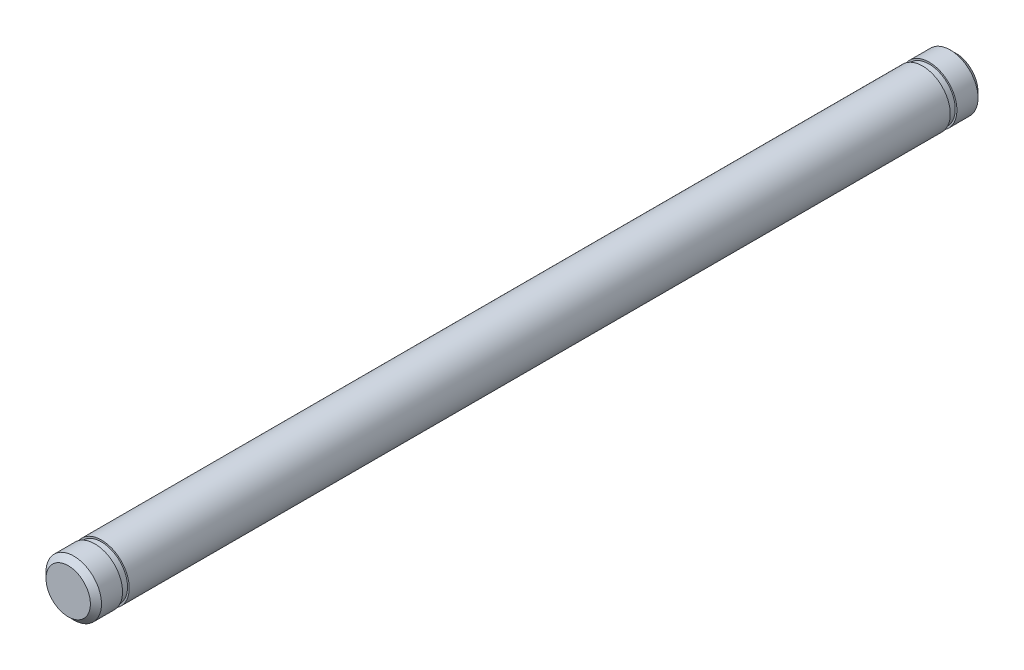
ISO-10303-21;
HEADER;
FILE_DESCRIPTION(('STEP AP214'),'2;1');
FILE_NAME('part.step','',(''),(''),'','','');
FILE_SCHEMA(('AUTOMOTIVE_DESIGN { 1 0 10303 214 1 1 1 1 }'));
ENDSEC;
DATA;
#1=APPLICATION_CONTEXT('core data for automotive mechanical design processes');
#2=APPLICATION_PROTOCOL_DEFINITION('international standard','automotive_design',2000,#1);
#3=PRODUCT_CONTEXT('',#1,'mechanical');
#4=PRODUCT('Part','Part','',(#3));
#5=PRODUCT_RELATED_PRODUCT_CATEGORY('part','',(#4));
#6=PRODUCT_DEFINITION_FORMATION('','',#4);
#7=PRODUCT_DEFINITION_CONTEXT('part definition',#1,'design');
#8=PRODUCT_DEFINITION('design','',#6,#7);
#9=PRODUCT_DEFINITION_SHAPE('','',#8);
#10=(LENGTH_UNIT() NAMED_UNIT(*) SI_UNIT(.MILLI.,.METRE.));
#11=(NAMED_UNIT(*) PLANE_ANGLE_UNIT() SI_UNIT($,.RADIAN.));
#12=(NAMED_UNIT(*) SI_UNIT($,.STERADIAN.) SOLID_ANGLE_UNIT());
#13=UNCERTAINTY_MEASURE_WITH_UNIT(LENGTH_MEASURE(1.E-05),#10,'distance_accuracy_value','');
#14=(GEOMETRIC_REPRESENTATION_CONTEXT(3) GLOBAL_UNCERTAINTY_ASSIGNED_CONTEXT((#13)) GLOBAL_UNIT_ASSIGNED_CONTEXT((#10,
#11,#12)) REPRESENTATION_CONTEXT('',''));
#15=CARTESIAN_POINT('',(0.,0.,0.));
#16=DIRECTION('',(0.,0.,1.));
#17=DIRECTION('',(1.,0.,0.));
#18=AXIS2_PLACEMENT_3D('',#15,#16,#17);
#19=CARTESIAN_POINT('',(0.,0.,80.));
#20=DIRECTION('',(0.,0.,-1.));
#21=DIRECTION('',(-1.,0.,0.));
#22=AXIS2_PLACEMENT_3D('',#19,#20,#21);
#23=CYLINDRICAL_SURFACE('',#22,2.5);
#24=CARTESIAN_POINT('',(0.,0.,3.));
#25=DIRECTION('',(0.,0.,-1.));
#26=DIRECTION('',(-1.,0.,0.));
#27=AXIS2_PLACEMENT_3D('',#24,#25,#26);
#28=CIRCLE('',#27,2.5);
#29=CARTESIAN_POINT('',(-2.5,0.,3.));
#30=VERTEX_POINT('',#29);
#31=EDGE_CURVE('E57',#30,#30,#28,.T.);
#32=ORIENTED_EDGE('',*,*,#31,.F.);
#33=EDGE_LOOP('',(#32));
#34=FACE_BOUND('',#33,.T.);
#35=CARTESIAN_POINT('',(0.,0.,77.));
#36=DIRECTION('',(0.,0.,-1.));
#37=DIRECTION('',(-1.,0.,0.));
#38=AXIS2_PLACEMENT_3D('',#35,#36,#37);
#39=CIRCLE('',#38,2.5);
#40=CARTESIAN_POINT('',(-2.5,0.,77.));
#41=VERTEX_POINT('',#40);
#42=EDGE_CURVE('E69',#41,#41,#39,.T.);
#43=ORIENTED_EDGE('',*,*,#42,.T.);
#44=EDGE_LOOP('',(#43));
#45=FACE_BOUND('',#44,.T.);
#46=ADVANCED_FACE('F35',(#34,#45),#23,.T.);
#47=CARTESIAN_POINT('',(0.,0.,2.4));
#48=DIRECTION('',(0.,0.,-1.));
#49=DIRECTION('',(-1.,0.,0.));
#50=AXIS2_PLACEMENT_3D('',#47,#48,#49);
#51=CIRCLE('',#50,2.5);
#52=CARTESIAN_POINT('',(-2.5,0.,2.4));
#53=VERTEX_POINT('',#52);
#54=EDGE_CURVE('E56',#53,#53,#51,.T.);
#55=ORIENTED_EDGE('',*,*,#54,.T.);
#56=EDGE_LOOP('',(#55));
#57=FACE_BOUND('',#56,.T.);
#58=CARTESIAN_POINT('',(0.,0.,0.5));
#59=DIRECTION('',(0.,0.,1.));
#60=DIRECTION('',(1.,0.,0.));
#61=AXIS2_PLACEMENT_3D('',#58,#59,#60);
#62=CIRCLE('',#61,2.5);
#63=CARTESIAN_POINT('',(2.5,0.,0.5));
#64=VERTEX_POINT('',#63);
#65=EDGE_CURVE('E47',#64,#64,#62,.T.);
#66=ORIENTED_EDGE('',*,*,#65,.T.);
#67=EDGE_LOOP('',(#66));
#68=FACE_BOUND('',#67,.T.);
#69=ADVANCED_FACE('F96',(#57,#68),#23,.T.);
#70=CARTESIAN_POINT('',(0.,0.,0.));
#71=DIRECTION('',(0.,0.,1.));
#72=DIRECTION('',(1.,0.,0.));
#73=AXIS2_PLACEMENT_3D('',#70,#71,#72);
#74=PLANE('',#73);
#75=CARTESIAN_POINT('',(0.,0.,0.));
#76=DIRECTION('',(0.,0.,1.));
#77=DIRECTION('',(1.,0.,0.));
#78=AXIS2_PLACEMENT_3D('',#75,#76,#77);
#79=CIRCLE('',#78,1.99999999999999);
#80=CARTESIAN_POINT('',(1.99999999999999,0.,0.));
#81=VERTEX_POINT('',#80);
#82=EDGE_CURVE('E10',#81,#81,#79,.F.);
#83=ORIENTED_EDGE('',*,*,#82,.T.);
#84=EDGE_LOOP('',(#83));
#85=FACE_BOUND('',#84,.T.);
#86=ADVANCED_FACE('F105',(#85),#74,.F.);
#87=CARTESIAN_POINT('',(0.,0.,0.5));
#88=DIRECTION('',(0.,0.,1.));
#89=DIRECTION('',(1.,0.,0.));
#90=AXIS2_PLACEMENT_3D('',#87,#88,#89);
#91=CONICAL_SURFACE('',#90,2.5,0.785398163397453);
#92=ORIENTED_EDGE('',*,*,#82,.F.);
#93=EDGE_LOOP('',(#92));
#94=FACE_BOUND('',#93,.T.);
#95=ORIENTED_EDGE('',*,*,#65,.F.);
#96=EDGE_LOOP('',(#95));
#97=FACE_BOUND('',#96,.T.);
#98=ADVANCED_FACE('F38',(#94,#97),#91,.T.);
#99=CARTESIAN_POINT('',(0.,0.,2.4));
#100=DIRECTION('',(0.,0.,-1.));
#101=DIRECTION('',(-1.,0.,0.));
#102=AXIS2_PLACEMENT_3D('',#99,#100,#101);
#103=PLANE('',#102);
#104=ORIENTED_EDGE('',*,*,#54,.F.);
#105=EDGE_LOOP('',(#104));
#106=FACE_BOUND('',#105,.T.);
#107=CARTESIAN_POINT('',(0.,0.,2.4));
#108=DIRECTION('',(0.,0.,-1.));
#109=DIRECTION('',(-1.,0.,0.));
#110=AXIS2_PLACEMENT_3D('',#107,#108,#109);
#111=CIRCLE('',#110,2.35);
#112=CARTESIAN_POINT('',(-2.35,0.,2.4));
#113=VERTEX_POINT('',#112);
#114=EDGE_CURVE('E60',#113,#113,#111,.T.);
#115=ORIENTED_EDGE('',*,*,#114,.T.);
#116=EDGE_LOOP('',(#115));
#117=FACE_BOUND('',#116,.T.);
#118=ADVANCED_FACE('F129',(#106,#117),#103,.F.);
#119=CARTESIAN_POINT('',(0.,0.,3.));
#120=DIRECTION('',(0.,0.,-1.));
#121=DIRECTION('',(-1.,0.,0.));
#122=AXIS2_PLACEMENT_3D('',#119,#120,#121);
#123=PLANE('',#122);
#124=ORIENTED_EDGE('',*,*,#31,.T.);
#125=EDGE_LOOP('',(#124));
#126=FACE_BOUND('',#125,.T.);
#127=CARTESIAN_POINT('',(0.,0.,3.));
#128=DIRECTION('',(0.,0.,-1.));
#129=DIRECTION('',(-1.,0.,0.));
#130=AXIS2_PLACEMENT_3D('',#127,#128,#129);
#131=CIRCLE('',#130,2.35);
#132=CARTESIAN_POINT('',(-2.35,0.,3.));
#133=VERTEX_POINT('',#132);
#134=EDGE_CURVE('E63',#133,#133,#131,.T.);
#135=ORIENTED_EDGE('',*,*,#134,.F.);
#136=EDGE_LOOP('',(#135));
#137=FACE_BOUND('',#136,.T.);
#138=ADVANCED_FACE('F127',(#126,#137),#123,.T.);
#139=CARTESIAN_POINT('',(0.,0.,2.4));
#140=DIRECTION('',(0.,0.,1.));
#141=DIRECTION('',(1.,0.,0.));
#142=AXIS2_PLACEMENT_3D('',#139,#140,#141);
#143=CYLINDRICAL_SURFACE('',#142,2.35);
#144=ORIENTED_EDGE('',*,*,#114,.F.);
#145=EDGE_LOOP('',(#144));
#146=FACE_BOUND('',#145,.T.);
#147=ORIENTED_EDGE('',*,*,#134,.T.);
#148=EDGE_LOOP('',(#147));
#149=FACE_BOUND('',#148,.T.);
#150=ADVANCED_FACE('F88',(#146,#149),#143,.T.);
#151=CARTESIAN_POINT('',(0.,0.,77.6));
#152=DIRECTION('',(0.,0.,1.));
#153=DIRECTION('',(-1.,0.,0.));
#154=AXIS2_PLACEMENT_3D('',#151,#152,#153);
#155=PLANE('',#154);
#156=CARTESIAN_POINT('',(0.,0.,77.6));
#157=DIRECTION('',(0.,0.,-1.));
#158=DIRECTION('',(-1.,0.,0.));
#159=AXIS2_PLACEMENT_3D('',#156,#157,#158);
#160=CIRCLE('',#159,2.35);
#161=CARTESIAN_POINT('',(-2.35,0.,77.6));
#162=VERTEX_POINT('',#161);
#163=EDGE_CURVE('E72',#162,#162,#160,.T.);
#164=ORIENTED_EDGE('',*,*,#163,.F.);
#165=EDGE_LOOP('',(#164));
#166=FACE_BOUND('',#165,.T.);
#167=CARTESIAN_POINT('',(0.,0.,77.6));
#168=DIRECTION('',(0.,0.,-1.));
#169=DIRECTION('',(-1.,0.,0.));
#170=AXIS2_PLACEMENT_3D('',#167,#168,#169);
#171=CIRCLE('',#170,2.5);
#172=CARTESIAN_POINT('',(-2.5,0.,77.6));
#173=VERTEX_POINT('',#172);
#174=EDGE_CURVE('E66',#173,#173,#171,.T.);
#175=ORIENTED_EDGE('',*,*,#174,.T.);
#176=EDGE_LOOP('',(#175));
#177=FACE_BOUND('',#176,.T.);
#178=ADVANCED_FACE('F84',(#166,#177),#155,.F.);
#179=CARTESIAN_POINT('',(0.,0.,77.));
#180=DIRECTION('',(0.,0.,1.));
#181=DIRECTION('',(-1.,0.,0.));
#182=AXIS2_PLACEMENT_3D('',#179,#180,#181);
#183=PLANE('',#182);
#184=CARTESIAN_POINT('',(0.,0.,77.));
#185=DIRECTION('',(0.,0.,-1.));
#186=DIRECTION('',(-1.,0.,0.));
#187=AXIS2_PLACEMENT_3D('',#184,#185,#186);
#188=CIRCLE('',#187,2.35);
#189=CARTESIAN_POINT('',(-2.35,0.,77.));
#190=VERTEX_POINT('',#189);
#191=EDGE_CURVE('E75',#190,#190,#188,.T.);
#192=ORIENTED_EDGE('',*,*,#191,.T.);
#193=EDGE_LOOP('',(#192));
#194=FACE_BOUND('',#193,.T.);
#195=ORIENTED_EDGE('',*,*,#42,.F.);
#196=EDGE_LOOP('',(#195));
#197=FACE_BOUND('',#196,.T.);
#198=ADVANCED_FACE('F87',(#194,#197),#183,.T.);
#199=CARTESIAN_POINT('',(0.,0.,77.6));
#200=DIRECTION('',(0.,0.,-1.));
#201=DIRECTION('',(-1.,0.,0.));
#202=AXIS2_PLACEMENT_3D('',#199,#200,#201);
#203=CYLINDRICAL_SURFACE('',#202,2.35);
#204=ORIENTED_EDGE('',*,*,#163,.T.);
#205=EDGE_LOOP('',(#204));
#206=FACE_BOUND('',#205,.T.);
#207=ORIENTED_EDGE('',*,*,#191,.F.);
#208=EDGE_LOOP('',(#207));
#209=FACE_BOUND('',#208,.T.);
#210=ADVANCED_FACE('F81',(#206,#209),#203,.T.);
#211=CARTESIAN_POINT('',(0.,0.,80.));
#212=DIRECTION('',(0.,0.,1.));
#213=DIRECTION('',(1.,0.,0.));
#214=AXIS2_PLACEMENT_3D('',#211,#212,#213);
#215=PLANE('',#214);
#216=CARTESIAN_POINT('',(0.,0.,80.));
#217=DIRECTION('',(0.,0.,1.));
#218=DIRECTION('',(1.,0.,0.));
#219=AXIS2_PLACEMENT_3D('',#216,#217,#218);
#220=CIRCLE('',#219,1.99999999999999);
#221=CARTESIAN_POINT('',(1.99999999999999,0.,80.));
#222=VERTEX_POINT('',#221);
#223=EDGE_CURVE('E51',#222,#222,#220,.T.);
#224=ORIENTED_EDGE('',*,*,#223,.T.);
#225=EDGE_LOOP('',(#224));
#226=FACE_BOUND('',#225,.T.);
#227=ADVANCED_FACE('F101',(#226),#215,.T.);
#228=CARTESIAN_POINT('',(0.,0.,80.));
#229=DIRECTION('',(0.,0.,-1.));
#230=DIRECTION('',(-1.,0.,0.));
#231=AXIS2_PLACEMENT_3D('',#228,#229,#230);
#232=CONICAL_SURFACE('',#231,1.99999999999999,0.785398163397467);
#233=CARTESIAN_POINT('',(0.,0.,79.5));
#234=DIRECTION('',(0.,0.,1.));
#235=DIRECTION('',(1.,0.,0.));
#236=AXIS2_PLACEMENT_3D('',#233,#234,#235);
#237=CIRCLE('',#236,2.5);
#238=CARTESIAN_POINT('',(2.5,0.,79.5));
#239=VERTEX_POINT('',#238);
#240=EDGE_CURVE('E43',#239,#239,#237,.F.);
#241=ORIENTED_EDGE('',*,*,#240,.F.);
#242=EDGE_LOOP('',(#241));
#243=FACE_BOUND('',#242,.T.);
#244=ORIENTED_EDGE('',*,*,#223,.F.);
#245=EDGE_LOOP('',(#244));
#246=FACE_BOUND('',#245,.T.);
#247=ADVANCED_FACE('F94',(#243,#246),#232,.T.);
#248=ORIENTED_EDGE('',*,*,#174,.F.);
#249=EDGE_LOOP('',(#248));
#250=FACE_BOUND('',#249,.T.);
#251=ORIENTED_EDGE('',*,*,#240,.T.);
#252=EDGE_LOOP('',(#251));
#253=FACE_BOUND('',#252,.T.);
#254=ADVANCED_FACE('F92',(#250,#253),#23,.T.);
#255=CLOSED_SHELL('',(#46,#69,#86,#98,#118,#138,#150,#178,#198,#210,#227,#247,#254));
#256=MANIFOLD_SOLID_BREP('B2',#255);
#257=ADVANCED_BREP_SHAPE_REPRESENTATION('',(#18,#256),#14);
#258=SHAPE_DEFINITION_REPRESENTATION(#9,#257);
ENDSEC;
END-ISO-10303-21;
